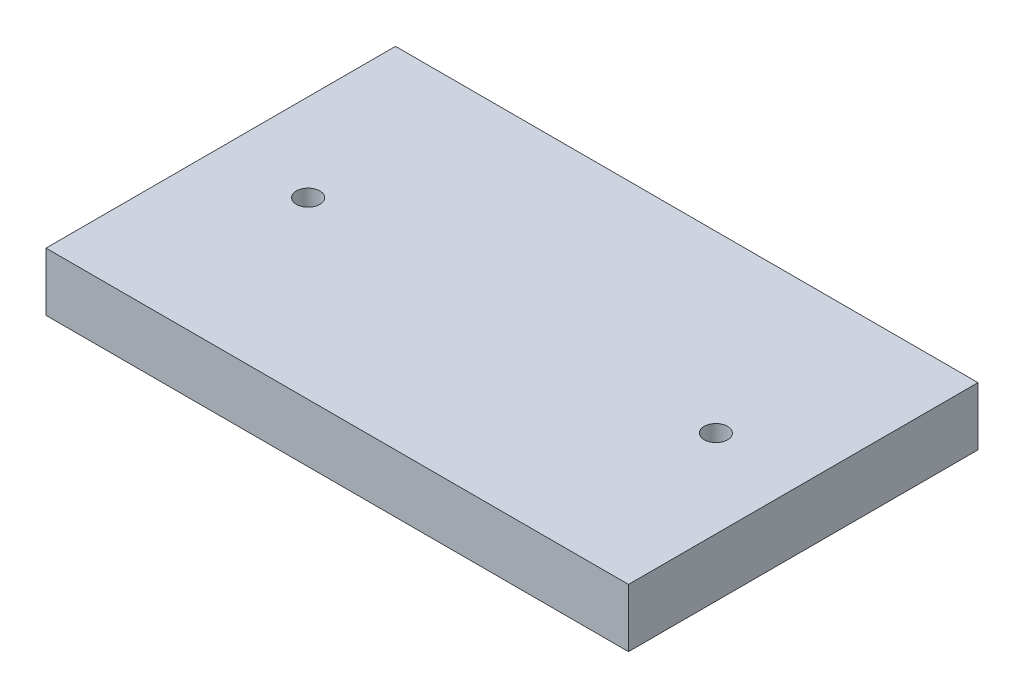
ISO-10303-21;
HEADER;
FILE_DESCRIPTION(('STEP AP214'),'2;1');
FILE_NAME('part.step','',(''),(''),'','','');
FILE_SCHEMA(('AUTOMOTIVE_DESIGN { 1 0 10303 214 1 1 1 1 }'));
ENDSEC;
DATA;
#1=APPLICATION_CONTEXT('core data for automotive mechanical design processes');
#2=APPLICATION_PROTOCOL_DEFINITION('international standard','automotive_design',2000,#1);
#3=PRODUCT_CONTEXT('',#1,'mechanical');
#4=PRODUCT('Part','Part','',(#3));
#5=PRODUCT_RELATED_PRODUCT_CATEGORY('part','',(#4));
#6=PRODUCT_DEFINITION_FORMATION('','',#4);
#7=PRODUCT_DEFINITION_CONTEXT('part definition',#1,'design');
#8=PRODUCT_DEFINITION('design','',#6,#7);
#9=PRODUCT_DEFINITION_SHAPE('','',#8);
#10=(LENGTH_UNIT() NAMED_UNIT(*) SI_UNIT(.MILLI.,.METRE.));
#11=(NAMED_UNIT(*) PLANE_ANGLE_UNIT() SI_UNIT($,.RADIAN.));
#12=(NAMED_UNIT(*) SI_UNIT($,.STERADIAN.) SOLID_ANGLE_UNIT());
#13=UNCERTAINTY_MEASURE_WITH_UNIT(LENGTH_MEASURE(1.E-05),#10,'distance_accuracy_value','');
#14=(GEOMETRIC_REPRESENTATION_CONTEXT(3) GLOBAL_UNCERTAINTY_ASSIGNED_CONTEXT((#13)) GLOBAL_UNIT_ASSIGNED_CONTEXT((#10,
#11,#12)) REPRESENTATION_CONTEXT('',''));
#15=CARTESIAN_POINT('',(0.,0.,0.));
#16=DIRECTION('',(0.,0.,1.));
#17=DIRECTION('',(1.,0.,0.));
#18=AXIS2_PLACEMENT_3D('',#15,#16,#17);
#19=CARTESIAN_POINT('',(0.,12.7,0.));
#20=DIRECTION('',(1.,0.,0.));
#21=DIRECTION('',(0.,0.,-1.));
#22=AXIS2_PLACEMENT_3D('',#19,#20,#21);
#23=PLANE('',#22);
#24=DIRECTION('',(0.,0.,1.));
#25=VECTOR('',#24,1.);
#26=CARTESIAN_POINT('',(0.,0.,0.));
#27=LINE('',#26,#25);
#28=CARTESIAN_POINT('',(0.,0.,-76.2));
#29=VERTEX_POINT('',#28);
#30=CARTESIAN_POINT('',(0.,0.,0.));
#31=VERTEX_POINT('',#30);
#32=EDGE_CURVE('E109',#29,#31,#27,.T.);
#33=ORIENTED_EDGE('',*,*,#32,.T.);
#34=DIRECTION('',(0.,-1.,0.));
#35=VECTOR('',#34,1.);
#36=CARTESIAN_POINT('',(0.,12.7,0.));
#37=LINE('',#36,#35);
#38=CARTESIAN_POINT('',(0.,12.7,0.));
#39=VERTEX_POINT('',#38);
#40=EDGE_CURVE('E13',#39,#31,#37,.T.);
#41=ORIENTED_EDGE('',*,*,#40,.F.);
#42=DIRECTION('',(0.,0.,1.));
#43=VECTOR('',#42,1.);
#44=CARTESIAN_POINT('',(0.,12.7,0.));
#45=LINE('',#44,#43);
#46=CARTESIAN_POINT('',(0.,12.7,-76.2));
#47=VERTEX_POINT('',#46);
#48=EDGE_CURVE('E97',#47,#39,#45,.T.);
#49=ORIENTED_EDGE('',*,*,#48,.F.);
#50=DIRECTION('',(0.,-1.,0.));
#51=VECTOR('',#50,1.);
#52=CARTESIAN_POINT('',(0.,12.7,-76.2));
#53=LINE('',#52,#51);
#54=EDGE_CURVE('E105',#47,#29,#53,.T.);
#55=ORIENTED_EDGE('',*,*,#54,.T.);
#56=EDGE_LOOP('',(#33,#41,#49,#55));
#57=FACE_BOUND('',#56,.T.);
#58=ADVANCED_FACE('F46',(#57),#23,.F.);
#59=CARTESIAN_POINT('',(0.,12.7,0.));
#60=DIRECTION('',(0.,0.,-1.));
#61=DIRECTION('',(-1.,0.,0.));
#62=AXIS2_PLACEMENT_3D('',#59,#60,#61);
#63=PLANE('',#62);
#64=DIRECTION('',(1.,0.,0.));
#65=VECTOR('',#64,1.);
#66=CARTESIAN_POINT('',(0.,0.,0.));
#67=LINE('',#66,#65);
#68=CARTESIAN_POINT('',(127.,0.,0.));
#69=VERTEX_POINT('',#68);
#70=EDGE_CURVE('E101',#31,#69,#67,.T.);
#71=ORIENTED_EDGE('',*,*,#70,.T.);
#72=DIRECTION('',(0.,-1.,0.));
#73=VECTOR('',#72,1.);
#74=CARTESIAN_POINT('',(127.,12.7,0.));
#75=LINE('',#74,#73);
#76=CARTESIAN_POINT('',(127.,12.7,0.));
#77=VERTEX_POINT('',#76);
#78=EDGE_CURVE('E54',#77,#69,#75,.T.);
#79=ORIENTED_EDGE('',*,*,#78,.F.);
#80=DIRECTION('',(1.,0.,0.));
#81=VECTOR('',#80,1.);
#82=CARTESIAN_POINT('',(0.,12.7,0.));
#83=LINE('',#82,#81);
#84=EDGE_CURVE('E92',#39,#77,#83,.T.);
#85=ORIENTED_EDGE('',*,*,#84,.F.);
#86=ORIENTED_EDGE('',*,*,#40,.T.);
#87=EDGE_LOOP('',(#71,#79,#85,#86));
#88=FACE_BOUND('',#87,.T.);
#89=ADVANCED_FACE('F100',(#88),#63,.F.);
#90=CARTESIAN_POINT('',(127.,12.7,0.));
#91=DIRECTION('',(-1.,0.,0.));
#92=DIRECTION('',(0.,0.,1.));
#93=AXIS2_PLACEMENT_3D('',#90,#91,#92);
#94=PLANE('',#93);
#95=DIRECTION('',(0.,0.,-1.));
#96=VECTOR('',#95,1.);
#97=CARTESIAN_POINT('',(127.,0.,0.));
#98=LINE('',#97,#96);
#99=CARTESIAN_POINT('',(127.,0.,-76.2));
#100=VERTEX_POINT('',#99);
#101=EDGE_CURVE('E79',#69,#100,#98,.T.);
#102=ORIENTED_EDGE('',*,*,#101,.T.);
#103=DIRECTION('',(0.,-1.,0.));
#104=VECTOR('',#103,1.);
#105=CARTESIAN_POINT('',(127.,12.7,-76.2));
#106=LINE('',#105,#104);
#107=CARTESIAN_POINT('',(127.,12.7,-76.2));
#108=VERTEX_POINT('',#107);
#109=EDGE_CURVE('E102',#108,#100,#106,.T.);
#110=ORIENTED_EDGE('',*,*,#109,.F.);
#111=DIRECTION('',(0.,0.,-1.));
#112=VECTOR('',#111,1.);
#113=CARTESIAN_POINT('',(127.,12.7,0.));
#114=LINE('',#113,#112);
#115=EDGE_CURVE('E95',#77,#108,#114,.T.);
#116=ORIENTED_EDGE('',*,*,#115,.F.);
#117=ORIENTED_EDGE('',*,*,#78,.T.);
#118=EDGE_LOOP('',(#102,#110,#116,#117));
#119=FACE_BOUND('',#118,.T.);
#120=ADVANCED_FACE('F103',(#119),#94,.F.);
#121=CARTESIAN_POINT('',(0.,12.7,-76.2));
#122=DIRECTION('',(0.,0.,1.));
#123=DIRECTION('',(1.,0.,0.));
#124=AXIS2_PLACEMENT_3D('',#121,#122,#123);
#125=PLANE('',#124);
#126=DIRECTION('',(-1.,0.,0.));
#127=VECTOR('',#126,1.);
#128=CARTESIAN_POINT('',(0.,0.,-76.2));
#129=LINE('',#128,#127);
#130=EDGE_CURVE('E85',#100,#29,#129,.T.);
#131=ORIENTED_EDGE('',*,*,#130,.T.);
#132=ORIENTED_EDGE('',*,*,#54,.F.);
#133=DIRECTION('',(-1.,0.,0.));
#134=VECTOR('',#133,1.);
#135=CARTESIAN_POINT('',(0.,12.7,-76.2));
#136=LINE('',#135,#134);
#137=EDGE_CURVE('E62',#108,#47,#136,.T.);
#138=ORIENTED_EDGE('',*,*,#137,.F.);
#139=ORIENTED_EDGE('',*,*,#109,.T.);
#140=EDGE_LOOP('',(#131,#132,#138,#139));
#141=FACE_BOUND('',#140,.T.);
#142=ADVANCED_FACE('F117',(#141),#125,.F.);
#143=CARTESIAN_POINT('',(0.,12.7,0.));
#144=DIRECTION('',(0.,-1.,0.));
#145=DIRECTION('',(0.,0.,-1.));
#146=AXIS2_PLACEMENT_3D('',#143,#144,#145);
#147=PLANE('',#146);
#148=CARTESIAN_POINT('',(19.05,12.7,-38.1));
#149=DIRECTION('',(0.,-1.,0.));
#150=DIRECTION('',(0.,0.,-1.));
#151=AXIS2_PLACEMENT_3D('',#148,#149,#150);
#152=CIRCLE('',#151,2.5527);
#153=CARTESIAN_POINT('',(19.05,12.7,-40.6527));
#154=VERTEX_POINT('',#153);
#155=EDGE_CURVE('E134',#154,#154,#152,.T.);
#156=ORIENTED_EDGE('',*,*,#155,.T.);
#157=EDGE_LOOP('',(#156));
#158=FACE_BOUND('',#157,.T.);
#159=CARTESIAN_POINT('',(107.95,12.7,-38.1));
#160=DIRECTION('',(0.,-1.,0.));
#161=DIRECTION('',(0.,0.,-1.));
#162=AXIS2_PLACEMENT_3D('',#159,#160,#161);
#163=CIRCLE('',#162,2.5527);
#164=CARTESIAN_POINT('',(107.95,12.7,-40.6527));
#165=VERTEX_POINT('',#164);
#166=EDGE_CURVE('E112',#165,#165,#163,.T.);
#167=ORIENTED_EDGE('',*,*,#166,.T.);
#168=EDGE_LOOP('',(#167));
#169=FACE_BOUND('',#168,.T.);
#170=ORIENTED_EDGE('',*,*,#48,.T.);
#171=ORIENTED_EDGE('',*,*,#84,.T.);
#172=ORIENTED_EDGE('',*,*,#115,.T.);
#173=ORIENTED_EDGE('',*,*,#137,.T.);
#174=EDGE_LOOP('',(#170,#171,#172,#173));
#175=FACE_BOUND('',#174,.T.);
#176=ADVANCED_FACE('F93',(#158,#169,#175),#147,.F.);
#177=CARTESIAN_POINT('',(0.,0.,0.));
#178=DIRECTION('',(0.,-1.,0.));
#179=DIRECTION('',(0.,0.,-1.));
#180=AXIS2_PLACEMENT_3D('',#177,#178,#179);
#181=PLANE('',#180);
#182=CARTESIAN_POINT('',(19.05,0.,-38.1));
#183=DIRECTION('',(0.,-1.,0.));
#184=DIRECTION('',(0.,0.,-1.));
#185=AXIS2_PLACEMENT_3D('',#182,#183,#184);
#186=CIRCLE('',#185,4.76249999999999);
#187=CARTESIAN_POINT('',(19.05,0.,-42.8625));
#188=VERTEX_POINT('',#187);
#189=EDGE_CURVE('E143',#188,#188,#186,.T.);
#190=ORIENTED_EDGE('',*,*,#189,.F.);
#191=EDGE_LOOP('',(#190));
#192=FACE_BOUND('',#191,.T.);
#193=CARTESIAN_POINT('',(107.95,0.,-38.1));
#194=DIRECTION('',(0.,-1.,0.));
#195=DIRECTION('',(0.,0.,-1.));
#196=AXIS2_PLACEMENT_3D('',#193,#194,#195);
#197=CIRCLE('',#196,4.76249999999999);
#198=CARTESIAN_POINT('',(107.95,0.,-42.8625));
#199=VERTEX_POINT('',#198);
#200=EDGE_CURVE('E131',#199,#199,#197,.T.);
#201=ORIENTED_EDGE('',*,*,#200,.F.);
#202=EDGE_LOOP('',(#201));
#203=FACE_BOUND('',#202,.T.);
#204=ORIENTED_EDGE('',*,*,#32,.F.);
#205=ORIENTED_EDGE('',*,*,#130,.F.);
#206=ORIENTED_EDGE('',*,*,#101,.F.);
#207=ORIENTED_EDGE('',*,*,#70,.F.);
#208=EDGE_LOOP('',(#204,#205,#206,#207));
#209=FACE_BOUND('',#208,.T.);
#210=ADVANCED_FACE('F120',(#192,#203,#209),#181,.T.);
#211=CARTESIAN_POINT('',(107.95,0.,-38.1));
#212=DIRECTION('',(0.,-1.,0.));
#213=DIRECTION('',(0.,0.,-1.));
#214=AXIS2_PLACEMENT_3D('',#211,#212,#213);
#215=CYLINDRICAL_SURFACE('',#214,2.5527);
#216=ORIENTED_EDGE('',*,*,#166,.F.);
#217=EDGE_LOOP('',(#216));
#218=FACE_BOUND('',#217,.T.);
#219=CARTESIAN_POINT('',(107.95,4.826,-38.1));
#220=DIRECTION('',(0.,-1.,0.));
#221=DIRECTION('',(0.,0.,-1.));
#222=AXIS2_PLACEMENT_3D('',#219,#220,#221);
#223=CIRCLE('',#222,2.55270000000001);
#224=CARTESIAN_POINT('',(107.95,4.826,-40.6527));
#225=VERTEX_POINT('',#224);
#226=EDGE_CURVE('E125',#225,#225,#223,.T.);
#227=ORIENTED_EDGE('',*,*,#226,.T.);
#228=EDGE_LOOP('',(#227));
#229=FACE_BOUND('',#228,.T.);
#230=ADVANCED_FACE('F151',(#218,#229),#215,.F.);
#231=CARTESIAN_POINT('',(110.5027,4.826,-38.1));
#232=DIRECTION('',(0.,1.,0.));
#233=DIRECTION('',(0.,0.,1.));
#234=AXIS2_PLACEMENT_3D('',#231,#232,#233);
#235=PLANE('',#234);
#236=ORIENTED_EDGE('',*,*,#226,.F.);
#237=EDGE_LOOP('',(#236));
#238=FACE_BOUND('',#237,.T.);
#239=CARTESIAN_POINT('',(107.95,4.826,-38.1));
#240=DIRECTION('',(0.,-1.,0.));
#241=DIRECTION('',(0.,0.,-1.));
#242=AXIS2_PLACEMENT_3D('',#239,#240,#241);
#243=CIRCLE('',#242,4.76249999999999);
#244=CARTESIAN_POINT('',(107.95,4.826,-42.8625));
#245=VERTEX_POINT('',#244);
#246=EDGE_CURVE('E128',#245,#245,#243,.T.);
#247=ORIENTED_EDGE('',*,*,#246,.T.);
#248=EDGE_LOOP('',(#247));
#249=FACE_BOUND('',#248,.T.);
#250=ADVANCED_FACE('F158',(#238,#249),#235,.F.);
#251=CARTESIAN_POINT('',(107.95,0.,-38.1));
#252=DIRECTION('',(0.,-1.,0.));
#253=DIRECTION('',(0.,0.,-1.));
#254=AXIS2_PLACEMENT_3D('',#251,#252,#253);
#255=CYLINDRICAL_SURFACE('',#254,4.76249999999999);
#256=ORIENTED_EDGE('',*,*,#246,.F.);
#257=EDGE_LOOP('',(#256));
#258=FACE_BOUND('',#257,.T.);
#259=ORIENTED_EDGE('',*,*,#200,.T.);
#260=EDGE_LOOP('',(#259));
#261=FACE_BOUND('',#260,.T.);
#262=ADVANCED_FACE('F155',(#258,#261),#255,.F.);
#263=CARTESIAN_POINT('',(19.05,0.,-38.1));
#264=DIRECTION('',(0.,-1.,0.));
#265=DIRECTION('',(0.,0.,-1.));
#266=AXIS2_PLACEMENT_3D('',#263,#264,#265);
#267=CYLINDRICAL_SURFACE('',#266,2.5527);
#268=ORIENTED_EDGE('',*,*,#155,.F.);
#269=EDGE_LOOP('',(#268));
#270=FACE_BOUND('',#269,.T.);
#271=CARTESIAN_POINT('',(19.05,4.826,-38.1));
#272=DIRECTION('',(0.,-1.,0.));
#273=DIRECTION('',(0.,0.,-1.));
#274=AXIS2_PLACEMENT_3D('',#271,#272,#273);
#275=CIRCLE('',#274,2.5527);
#276=CARTESIAN_POINT('',(19.05,4.826,-40.6527));
#277=VERTEX_POINT('',#276);
#278=EDGE_CURVE('E137',#277,#277,#275,.T.);
#279=ORIENTED_EDGE('',*,*,#278,.T.);
#280=EDGE_LOOP('',(#279));
#281=FACE_BOUND('',#280,.T.);
#282=ADVANCED_FACE('F157',(#270,#281),#267,.F.);
#283=CARTESIAN_POINT('',(21.6027,4.826,-38.1));
#284=DIRECTION('',(0.,1.,0.));
#285=DIRECTION('',(0.,0.,1.));
#286=AXIS2_PLACEMENT_3D('',#283,#284,#285);
#287=PLANE('',#286);
#288=ORIENTED_EDGE('',*,*,#278,.F.);
#289=EDGE_LOOP('',(#288));
#290=FACE_BOUND('',#289,.T.);
#291=CARTESIAN_POINT('',(19.05,4.826,-38.1));
#292=DIRECTION('',(0.,-1.,0.));
#293=DIRECTION('',(0.,0.,-1.));
#294=AXIS2_PLACEMENT_3D('',#291,#292,#293);
#295=CIRCLE('',#294,4.7625);
#296=CARTESIAN_POINT('',(19.05,4.826,-42.8625));
#297=VERTEX_POINT('',#296);
#298=EDGE_CURVE('E140',#297,#297,#295,.T.);
#299=ORIENTED_EDGE('',*,*,#298,.T.);
#300=EDGE_LOOP('',(#299));
#301=FACE_BOUND('',#300,.T.);
#302=ADVANCED_FACE('F165',(#290,#301),#287,.F.);
#303=CARTESIAN_POINT('',(19.05,0.,-38.1));
#304=DIRECTION('',(0.,-1.,0.));
#305=DIRECTION('',(0.,0.,-1.));
#306=AXIS2_PLACEMENT_3D('',#303,#304,#305);
#307=CYLINDRICAL_SURFACE('',#306,4.76249999999999);
#308=ORIENTED_EDGE('',*,*,#298,.F.);
#309=EDGE_LOOP('',(#308));
#310=FACE_BOUND('',#309,.T.);
#311=ORIENTED_EDGE('',*,*,#189,.T.);
#312=EDGE_LOOP('',(#311));
#313=FACE_BOUND('',#312,.T.);
#314=ADVANCED_FACE('F147',(#310,#313),#307,.F.);
#315=CLOSED_SHELL('',(#58,#89,#120,#142,#176,#210,#230,#250,#262,#282,#302,#314));
#316=MANIFOLD_SOLID_BREP('B2',#315);
#317=ADVANCED_BREP_SHAPE_REPRESENTATION('',(#18,#316),#14);
#318=SHAPE_DEFINITION_REPRESENTATION(#9,#317);
ENDSEC;
END-ISO-10303-21;
